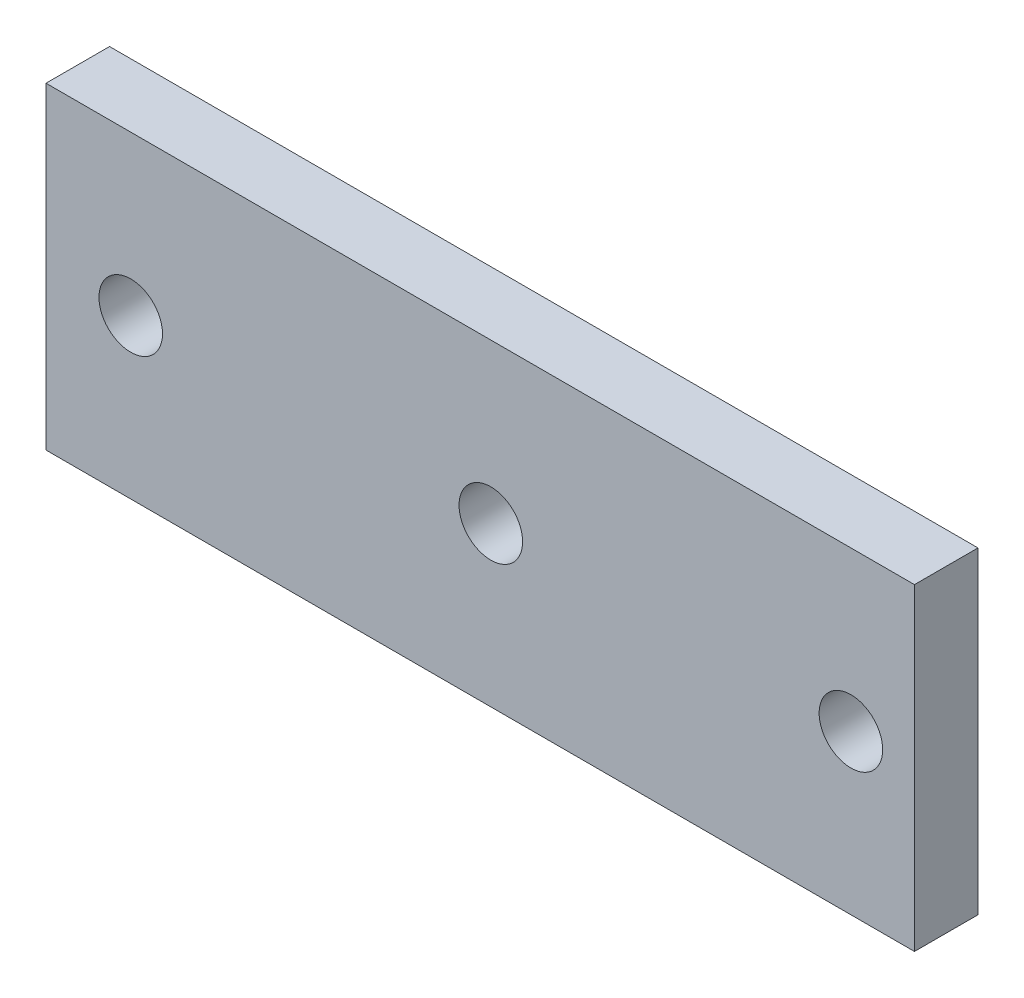
ISO-10303-21;
HEADER;
FILE_DESCRIPTION(('STEP AP214'),'2;1');
FILE_NAME('part.step','',(''),(''),'','','');
FILE_SCHEMA(('AUTOMOTIVE_DESIGN { 1 0 10303 214 1 1 1 1 }'));
ENDSEC;
DATA;
#1=APPLICATION_CONTEXT('core data for automotive mechanical design processes');
#2=APPLICATION_PROTOCOL_DEFINITION('international standard','automotive_design',2000,#1);
#3=PRODUCT_CONTEXT('',#1,'mechanical');
#4=PRODUCT('Part','Part','',(#3));
#5=PRODUCT_RELATED_PRODUCT_CATEGORY('part','',(#4));
#6=PRODUCT_DEFINITION_FORMATION('','',#4);
#7=PRODUCT_DEFINITION_CONTEXT('part definition',#1,'design');
#8=PRODUCT_DEFINITION('design','',#6,#7);
#9=PRODUCT_DEFINITION_SHAPE('','',#8);
#10=(LENGTH_UNIT() NAMED_UNIT(*) SI_UNIT(.MILLI.,.METRE.));
#11=(NAMED_UNIT(*) PLANE_ANGLE_UNIT() SI_UNIT($,.RADIAN.));
#12=(NAMED_UNIT(*) SI_UNIT($,.STERADIAN.) SOLID_ANGLE_UNIT());
#13=UNCERTAINTY_MEASURE_WITH_UNIT(LENGTH_MEASURE(1.E-05),#10,'distance_accuracy_value','');
#14=(GEOMETRIC_REPRESENTATION_CONTEXT(3) GLOBAL_UNCERTAINTY_ASSIGNED_CONTEXT((#13)) GLOBAL_UNIT_ASSIGNED_CONTEXT((#10,
#11,#12)) REPRESENTATION_CONTEXT('',''));
#15=CARTESIAN_POINT('',(0.,0.,0.));
#16=DIRECTION('',(0.,0.,1.));
#17=DIRECTION('',(1.,0.,0.));
#18=AXIS2_PLACEMENT_3D('',#15,#16,#17);
#19=CARTESIAN_POINT('',(20.5,-7.5,3.));
#20=DIRECTION('',(-1.,0.,0.));
#21=DIRECTION('',(0.,0.,1.));
#22=AXIS2_PLACEMENT_3D('',#19,#20,#21);
#23=PLANE('',#22);
#24=DIRECTION('',(0.,1.,0.));
#25=VECTOR('',#24,1.);
#26=CARTESIAN_POINT('',(20.5,-7.5,0.));
#27=LINE('',#26,#25);
#28=CARTESIAN_POINT('',(20.5,-7.5,0.));
#29=VERTEX_POINT('',#28);
#30=CARTESIAN_POINT('',(20.5,7.5,0.));
#31=VERTEX_POINT('',#30);
#32=EDGE_CURVE('E107',#29,#31,#27,.T.);
#33=ORIENTED_EDGE('',*,*,#32,.T.);
#34=DIRECTION('',(0.,0.,-1.));
#35=VECTOR('',#34,1.);
#36=CARTESIAN_POINT('',(20.5,7.5,3.));
#37=LINE('',#36,#35);
#38=CARTESIAN_POINT('',(20.5,7.5,3.));
#39=VERTEX_POINT('',#38);
#40=EDGE_CURVE('E11',#39,#31,#37,.T.);
#41=ORIENTED_EDGE('',*,*,#40,.F.);
#42=DIRECTION('',(0.,1.,0.));
#43=VECTOR('',#42,1.);
#44=CARTESIAN_POINT('',(20.5,-7.5,3.));
#45=LINE('',#44,#43);
#46=CARTESIAN_POINT('',(20.5,-7.5,3.));
#47=VERTEX_POINT('',#46);
#48=EDGE_CURVE('E91',#47,#39,#45,.T.);
#49=ORIENTED_EDGE('',*,*,#48,.F.);
#50=DIRECTION('',(0.,0.,-1.));
#51=VECTOR('',#50,1.);
#52=CARTESIAN_POINT('',(20.5,-7.5,3.));
#53=LINE('',#52,#51);
#54=EDGE_CURVE('E103',#47,#29,#53,.T.);
#55=ORIENTED_EDGE('',*,*,#54,.T.);
#56=EDGE_LOOP('',(#33,#41,#49,#55));
#57=FACE_BOUND('',#56,.T.);
#58=ADVANCED_FACE('F39',(#57),#23,.F.);
#59=CARTESIAN_POINT('',(-20.5,7.5,3.));
#60=DIRECTION('',(0.,-1.,0.));
#61=DIRECTION('',(0.,0.,-1.));
#62=AXIS2_PLACEMENT_3D('',#59,#60,#61);
#63=PLANE('',#62);
#64=DIRECTION('',(-1.,0.,0.));
#65=VECTOR('',#64,1.);
#66=CARTESIAN_POINT('',(-20.5,7.5,0.));
#67=LINE('',#66,#65);
#68=CARTESIAN_POINT('',(-20.5,7.5,0.));
#69=VERTEX_POINT('',#68);
#70=EDGE_CURVE('E96',#31,#69,#67,.T.);
#71=ORIENTED_EDGE('',*,*,#70,.T.);
#72=DIRECTION('',(0.,0.,-1.));
#73=VECTOR('',#72,1.);
#74=CARTESIAN_POINT('',(-20.5,7.5,3.));
#75=LINE('',#74,#73);
#76=CARTESIAN_POINT('',(-20.5,7.5,3.));
#77=VERTEX_POINT('',#76);
#78=EDGE_CURVE('E48',#77,#69,#75,.T.);
#79=ORIENTED_EDGE('',*,*,#78,.F.);
#80=DIRECTION('',(-1.,0.,0.));
#81=VECTOR('',#80,1.);
#82=CARTESIAN_POINT('',(-20.5,7.5,3.));
#83=LINE('',#82,#81);
#84=EDGE_CURVE('E86',#39,#77,#83,.T.);
#85=ORIENTED_EDGE('',*,*,#84,.F.);
#86=ORIENTED_EDGE('',*,*,#40,.T.);
#87=EDGE_LOOP('',(#71,#79,#85,#86));
#88=FACE_BOUND('',#87,.T.);
#89=ADVANCED_FACE('F95',(#88),#63,.F.);
#90=CARTESIAN_POINT('',(-20.5,-7.5,3.));
#91=DIRECTION('',(1.,0.,0.));
#92=DIRECTION('',(0.,0.,-1.));
#93=AXIS2_PLACEMENT_3D('',#90,#91,#92);
#94=PLANE('',#93);
#95=DIRECTION('',(0.,-1.,0.));
#96=VECTOR('',#95,1.);
#97=CARTESIAN_POINT('',(-20.5,-7.5,0.));
#98=LINE('',#97,#96);
#99=CARTESIAN_POINT('',(-20.5,-7.5,0.));
#100=VERTEX_POINT('',#99);
#101=EDGE_CURVE('E73',#69,#100,#98,.T.);
#102=ORIENTED_EDGE('',*,*,#101,.T.);
#103=DIRECTION('',(0.,0.,-1.));
#104=VECTOR('',#103,1.);
#105=CARTESIAN_POINT('',(-20.5,-7.5,3.));
#106=LINE('',#105,#104);
#107=CARTESIAN_POINT('',(-20.5,-7.5,3.));
#108=VERTEX_POINT('',#107);
#109=EDGE_CURVE('E98',#108,#100,#106,.T.);
#110=ORIENTED_EDGE('',*,*,#109,.F.);
#111=DIRECTION('',(0.,-1.,0.));
#112=VECTOR('',#111,1.);
#113=CARTESIAN_POINT('',(-20.5,-7.5,3.));
#114=LINE('',#113,#112);
#115=EDGE_CURVE('E89',#77,#108,#114,.T.);
#116=ORIENTED_EDGE('',*,*,#115,.F.);
#117=ORIENTED_EDGE('',*,*,#78,.T.);
#118=EDGE_LOOP('',(#102,#110,#116,#117));
#119=FACE_BOUND('',#118,.T.);
#120=ADVANCED_FACE('F99',(#119),#94,.F.);
#121=CARTESIAN_POINT('',(-20.5,-7.5,3.));
#122=DIRECTION('',(0.,1.,0.));
#123=DIRECTION('',(0.,0.,1.));
#124=AXIS2_PLACEMENT_3D('',#121,#122,#123);
#125=PLANE('',#124);
#126=DIRECTION('',(1.,0.,0.));
#127=VECTOR('',#126,1.);
#128=CARTESIAN_POINT('',(-20.5,-7.5,0.));
#129=LINE('',#128,#127);
#130=EDGE_CURVE('E79',#100,#29,#129,.T.);
#131=ORIENTED_EDGE('',*,*,#130,.T.);
#132=ORIENTED_EDGE('',*,*,#54,.F.);
#133=DIRECTION('',(1.,0.,0.));
#134=VECTOR('',#133,1.);
#135=CARTESIAN_POINT('',(-20.5,-7.5,3.));
#136=LINE('',#135,#134);
#137=EDGE_CURVE('E56',#108,#47,#136,.T.);
#138=ORIENTED_EDGE('',*,*,#137,.F.);
#139=ORIENTED_EDGE('',*,*,#109,.T.);
#140=EDGE_LOOP('',(#131,#132,#138,#139));
#141=FACE_BOUND('',#140,.T.);
#142=ADVANCED_FACE('F121',(#141),#125,.F.);
#143=CARTESIAN_POINT('',(0.,0.,3.));
#144=DIRECTION('',(0.,0.,-1.));
#145=DIRECTION('',(-1.,0.,0.));
#146=AXIS2_PLACEMENT_3D('',#143,#144,#145);
#147=PLANE('',#146);
#148=CARTESIAN_POINT('',(-16.5,0.,3.));
#149=DIRECTION('',(0.,0.,1.));
#150=DIRECTION('',(1.,0.,0.));
#151=AXIS2_PLACEMENT_3D('',#148,#149,#150);
#152=CIRCLE('',#151,1.5);
#153=CARTESIAN_POINT('',(-15.,0.,3.));
#154=VERTEX_POINT('',#153);
#155=EDGE_CURVE('E144',#154,#154,#152,.T.);
#156=ORIENTED_EDGE('',*,*,#155,.F.);
#157=EDGE_LOOP('',(#156));
#158=FACE_BOUND('',#157,.T.);
#159=CARTESIAN_POINT('',(0.5,0.,3.));
#160=DIRECTION('',(0.,0.,1.));
#161=DIRECTION('',(1.,0.,0.));
#162=AXIS2_PLACEMENT_3D('',#159,#160,#161);
#163=CIRCLE('',#162,1.5);
#164=CARTESIAN_POINT('',(2.,0.,3.));
#165=VERTEX_POINT('',#164);
#166=EDGE_CURVE('E136',#165,#165,#163,.T.);
#167=ORIENTED_EDGE('',*,*,#166,.F.);
#168=EDGE_LOOP('',(#167));
#169=FACE_BOUND('',#168,.T.);
#170=CARTESIAN_POINT('',(17.5,0.,3.));
#171=DIRECTION('',(0.,0.,1.));
#172=DIRECTION('',(1.,0.,0.));
#173=AXIS2_PLACEMENT_3D('',#170,#171,#172);
#174=CIRCLE('',#173,1.5);
#175=CARTESIAN_POINT('',(19.,0.,3.));
#176=VERTEX_POINT('',#175);
#177=EDGE_CURVE('E128',#176,#176,#174,.T.);
#178=ORIENTED_EDGE('',*,*,#177,.F.);
#179=EDGE_LOOP('',(#178));
#180=FACE_BOUND('',#179,.T.);
#181=ORIENTED_EDGE('',*,*,#48,.T.);
#182=ORIENTED_EDGE('',*,*,#84,.T.);
#183=ORIENTED_EDGE('',*,*,#115,.T.);
#184=ORIENTED_EDGE('',*,*,#137,.T.);
#185=EDGE_LOOP('',(#181,#182,#183,#184));
#186=FACE_BOUND('',#185,.T.);
#187=ADVANCED_FACE('F87',(#158,#169,#180,#186),#147,.F.);
#188=CARTESIAN_POINT('',(0.,0.,0.));
#189=DIRECTION('',(0.,0.,-1.));
#190=DIRECTION('',(-1.,0.,0.));
#191=AXIS2_PLACEMENT_3D('',#188,#189,#190);
#192=PLANE('',#191);
#193=CARTESIAN_POINT('',(-16.5,0.,0.));
#194=DIRECTION('',(0.,0.,1.));
#195=DIRECTION('',(1.,0.,0.));
#196=AXIS2_PLACEMENT_3D('',#193,#194,#195);
#197=CIRCLE('',#196,1.5);
#198=CARTESIAN_POINT('',(-15.,0.,0.));
#199=VERTEX_POINT('',#198);
#200=EDGE_CURVE('E111',#199,#199,#197,.T.);
#201=ORIENTED_EDGE('',*,*,#200,.T.);
#202=EDGE_LOOP('',(#201));
#203=FACE_BOUND('',#202,.T.);
#204=CARTESIAN_POINT('',(0.5,0.,0.));
#205=DIRECTION('',(0.,0.,1.));
#206=DIRECTION('',(1.,0.,0.));
#207=AXIS2_PLACEMENT_3D('',#204,#205,#206);
#208=CIRCLE('',#207,1.5);
#209=CARTESIAN_POINT('',(2.,0.,0.));
#210=VERTEX_POINT('',#209);
#211=EDGE_CURVE('E140',#210,#210,#208,.T.);
#212=ORIENTED_EDGE('',*,*,#211,.T.);
#213=EDGE_LOOP('',(#212));
#214=FACE_BOUND('',#213,.T.);
#215=CARTESIAN_POINT('',(17.5,0.,0.));
#216=DIRECTION('',(0.,0.,1.));
#217=DIRECTION('',(1.,0.,0.));
#218=AXIS2_PLACEMENT_3D('',#215,#216,#217);
#219=CIRCLE('',#218,1.5);
#220=CARTESIAN_POINT('',(19.,0.,0.));
#221=VERTEX_POINT('',#220);
#222=EDGE_CURVE('E132',#221,#221,#219,.T.);
#223=ORIENTED_EDGE('',*,*,#222,.T.);
#224=EDGE_LOOP('',(#223));
#225=FACE_BOUND('',#224,.T.);
#226=ORIENTED_EDGE('',*,*,#32,.F.);
#227=ORIENTED_EDGE('',*,*,#130,.F.);
#228=ORIENTED_EDGE('',*,*,#101,.F.);
#229=ORIENTED_EDGE('',*,*,#70,.F.);
#230=EDGE_LOOP('',(#226,#227,#228,#229));
#231=FACE_BOUND('',#230,.T.);
#232=ADVANCED_FACE('F124',(#203,#214,#225,#231),#192,.T.);
#233=CARTESIAN_POINT('',(17.5,0.,0.));
#234=DIRECTION('',(0.,0.,1.));
#235=DIRECTION('',(1.,0.,0.));
#236=AXIS2_PLACEMENT_3D('',#233,#234,#235);
#237=CYLINDRICAL_SURFACE('',#236,1.5);
#238=ORIENTED_EDGE('',*,*,#222,.F.);
#239=EDGE_LOOP('',(#238));
#240=FACE_BOUND('',#239,.T.);
#241=ORIENTED_EDGE('',*,*,#177,.T.);
#242=EDGE_LOOP('',(#241));
#243=FACE_BOUND('',#242,.T.);
#244=ADVANCED_FACE('F168',(#240,#243),#237,.F.);
#245=CARTESIAN_POINT('',(0.5,0.,0.));
#246=DIRECTION('',(0.,0.,1.));
#247=DIRECTION('',(1.,0.,0.));
#248=AXIS2_PLACEMENT_3D('',#245,#246,#247);
#249=CYLINDRICAL_SURFACE('',#248,1.5);
#250=ORIENTED_EDGE('',*,*,#211,.F.);
#251=EDGE_LOOP('',(#250));
#252=FACE_BOUND('',#251,.T.);
#253=ORIENTED_EDGE('',*,*,#166,.T.);
#254=EDGE_LOOP('',(#253));
#255=FACE_BOUND('',#254,.T.);
#256=ADVANCED_FACE('F157',(#252,#255),#249,.F.);
#257=CARTESIAN_POINT('',(-16.5,0.,0.));
#258=DIRECTION('',(0.,0.,1.));
#259=DIRECTION('',(1.,0.,0.));
#260=AXIS2_PLACEMENT_3D('',#257,#258,#259);
#261=CYLINDRICAL_SURFACE('',#260,1.5);
#262=ORIENTED_EDGE('',*,*,#200,.F.);
#263=EDGE_LOOP('',(#262));
#264=FACE_BOUND('',#263,.T.);
#265=ORIENTED_EDGE('',*,*,#155,.T.);
#266=EDGE_LOOP('',(#265));
#267=FACE_BOUND('',#266,.T.);
#268=ADVANCED_FACE('F154',(#264,#267),#261,.F.);
#269=CLOSED_SHELL('',(#58,#89,#120,#142,#187,#232,#244,#256,#268));
#270=MANIFOLD_SOLID_BREP('B2',#269);
#271=ADVANCED_BREP_SHAPE_REPRESENTATION('',(#18,#270),#14);
#272=SHAPE_DEFINITION_REPRESENTATION(#9,#271);
ENDSEC;
END-ISO-10303-21;
